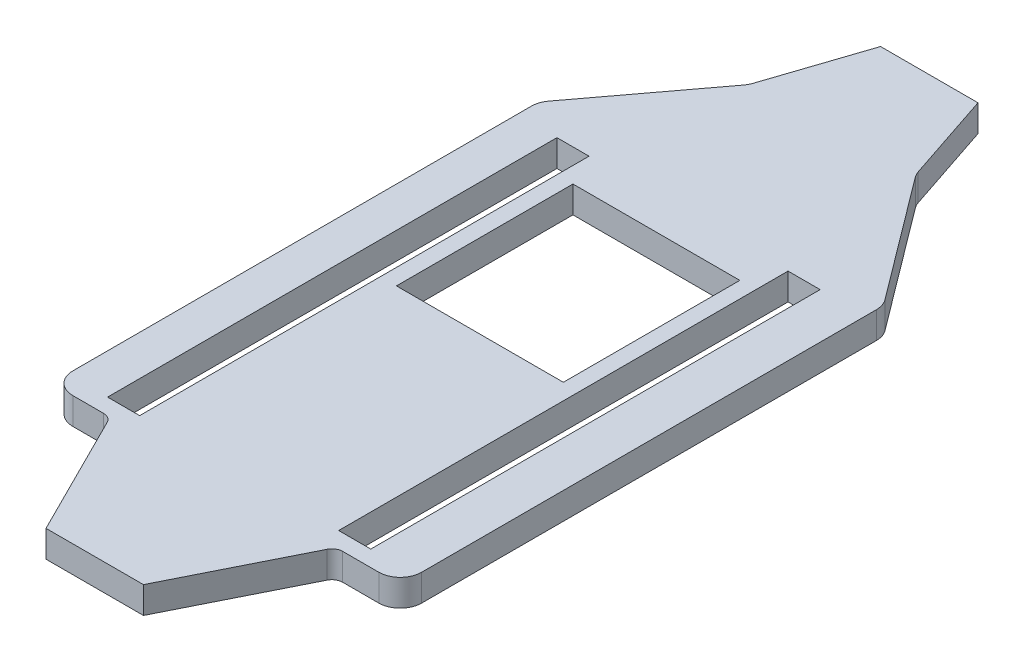
ISO-10303-21;
HEADER;
FILE_DESCRIPTION(('STEP AP214'),'2;1');
FILE_NAME('part.step','',(''),(''),'','','');
FILE_SCHEMA(('AUTOMOTIVE_DESIGN { 1 0 10303 214 1 1 1 1 }'));
ENDSEC;
DATA;
#1=APPLICATION_CONTEXT('core data for automotive mechanical design processes');
#2=APPLICATION_PROTOCOL_DEFINITION('international standard','automotive_design',2000,#1);
#3=PRODUCT_CONTEXT('',#1,'mechanical');
#4=PRODUCT('Part','Part','',(#3));
#5=PRODUCT_RELATED_PRODUCT_CATEGORY('part','',(#4));
#6=PRODUCT_DEFINITION_FORMATION('','',#4);
#7=PRODUCT_DEFINITION_CONTEXT('part definition',#1,'design');
#8=PRODUCT_DEFINITION('design','',#6,#7);
#9=PRODUCT_DEFINITION_SHAPE('','',#8);
#10=(LENGTH_UNIT() NAMED_UNIT(*) SI_UNIT(.MILLI.,.METRE.));
#11=(NAMED_UNIT(*) PLANE_ANGLE_UNIT() SI_UNIT($,.RADIAN.));
#12=(NAMED_UNIT(*) SI_UNIT($,.STERADIAN.) SOLID_ANGLE_UNIT());
#13=UNCERTAINTY_MEASURE_WITH_UNIT(LENGTH_MEASURE(1.E-05),#10,'distance_accuracy_value','');
#14=(GEOMETRIC_REPRESENTATION_CONTEXT(3) GLOBAL_UNCERTAINTY_ASSIGNED_CONTEXT((#13)) GLOBAL_UNIT_ASSIGNED_CONTEXT((#10,
#11,#12)) REPRESENTATION_CONTEXT('',''));
#15=CARTESIAN_POINT('',(0.,0.,0.));
#16=DIRECTION('',(0.,0.,1.));
#17=DIRECTION('',(1.,0.,0.));
#18=AXIS2_PLACEMENT_3D('',#15,#16,#17);
#19=CARTESIAN_POINT('',(-12.994733192202,1.25,-28.8403557437306));
#20=DIRECTION('',(0.,-1.,0.));
#21=DIRECTION('',(0.,0.,-1.));
#22=AXIS2_PLACEMENT_3D('',#19,#20,#21);
#23=PLANE('',#22);
#24=DIRECTION('',(0.,0.,1.));
#25=VECTOR('',#24,1.);
#26=CARTESIAN_POINT('',(-14.4270462766947,1.25,-0.749999999999999));
#27=LINE('',#26,#25);
#28=CARTESIAN_POINT('',(-14.4270462766947,1.25,-21.75));
#29=VERTEX_POINT('',#28);
#30=CARTESIAN_POINT('',(-14.4270462766947,1.25,-0.749999999999999));
#31=VERTEX_POINT('',#30);
#32=EDGE_CURVE('E284',#29,#31,#27,.T.);
#33=ORIENTED_EDGE('',*,*,#32,.F.);
#34=DIRECTION('',(-1.,0.,0.));
#35=VECTOR('',#34,1.);
#36=CARTESIAN_POINT('',(-14.4270462766947,1.25,-21.75));
#37=LINE('',#36,#35);
#38=CARTESIAN_POINT('',(-12.9270462766947,1.25,-21.75));
#39=VERTEX_POINT('',#38);
#40=EDGE_CURVE('E292',#39,#29,#37,.T.);
#41=ORIENTED_EDGE('',*,*,#40,.F.);
#42=DIRECTION('',(0.,0.,-1.));
#43=VECTOR('',#42,1.);
#44=CARTESIAN_POINT('',(-12.9270462766947,1.25,-0.749999999999999));
#45=LINE('',#44,#43);
#46=CARTESIAN_POINT('',(-12.9270462766947,1.25,-0.749999999999999));
#47=VERTEX_POINT('',#46);
#48=EDGE_CURVE('E289',#47,#39,#45,.T.);
#49=ORIENTED_EDGE('',*,*,#48,.F.);
#50=DIRECTION('',(1.,0.,0.));
#51=VECTOR('',#50,1.);
#52=CARTESIAN_POINT('',(-14.4270462766947,1.25,-0.749999999999999));
#53=LINE('',#52,#51);
#54=EDGE_CURVE('E286',#31,#47,#53,.T.);
#55=ORIENTED_EDGE('',*,*,#54,.F.);
#56=EDGE_LOOP('',(#33,#41,#49,#55));
#57=FACE_BOUND('',#56,.T.);
#58=DIRECTION('',(-1.,0.,0.));
#59=VECTOR('',#58,1.);
#60=CARTESIAN_POINT('',(-6.,1.25,-33.));
#61=LINE('',#60,#59);
#62=CARTESIAN_POINT('',(-6.,1.25,-33.));
#63=VERTEX_POINT('',#62);
#64=CARTESIAN_POINT('',(-10.5540925533895,1.25,-33.));
#65=VERTEX_POINT('',#64);
#66=EDGE_CURVE('E346',#63,#65,#61,.T.);
#67=ORIENTED_EDGE('',*,*,#66,.T.);
#68=DIRECTION('',(-0.316227766016836,0.,0.948683298050514));
#69=VECTOR('',#68,1.);
#70=CARTESIAN_POINT('',(-12.0460498941515,1.25,-28.5241279777138));
#71=LINE('',#70,#69);
#72=CARTESIAN_POINT('',(-12.0460498941515,1.25,-28.5241279777138));
#73=VERTEX_POINT('',#72);
#74=EDGE_CURVE('E349',#65,#73,#71,.T.);
#75=ORIENTED_EDGE('',*,*,#74,.T.);
#76=CARTESIAN_POINT('',(-12.994733192202,1.25,-28.8403557437306));
#77=DIRECTION('',(0.,-1.,0.));
#78=DIRECTION('',(0.,0.,-1.));
#79=AXIS2_PLACEMENT_3D('',#76,#77,#78);
#80=CIRCLE('',#79,1.);
#81=CARTESIAN_POINT('',(-12.194733192202,1.25,-28.2403557437306));
#82=VERTEX_POINT('',#81);
#83=EDGE_CURVE('E352',#73,#82,#80,.T.);
#84=ORIENTED_EDGE('',*,*,#83,.T.);
#85=DIRECTION('',(-0.6,0.,0.8));
#86=VECTOR('',#85,1.);
#87=CARTESIAN_POINT('',(-12.194733192202,1.25,-28.2403557437306));
#88=LINE('',#87,#86);
#89=CARTESIAN_POINT('',(-16.1,1.25,-23.0333333333333));
#90=VERTEX_POINT('',#89);
#91=EDGE_CURVE('E354',#82,#90,#88,.T.);
#92=ORIENTED_EDGE('',*,*,#91,.T.);
#93=CARTESIAN_POINT('',(-15.3,1.25,-22.4333333333333));
#94=DIRECTION('',(0.,1.,0.));
#95=DIRECTION('',(0.,0.,-1.));
#96=AXIS2_PLACEMENT_3D('',#93,#94,#95);
#97=CIRCLE('',#96,1.);
#98=CARTESIAN_POINT('',(-16.3,1.25,-22.4333333333333));
#99=VERTEX_POINT('',#98);
#100=EDGE_CURVE('E356',#90,#99,#97,.T.);
#101=ORIENTED_EDGE('',*,*,#100,.T.);
#102=DIRECTION('',(0.,0.,1.));
#103=VECTOR('',#102,1.);
#104=CARTESIAN_POINT('',(-16.3,1.25,-22.4333333333333));
#105=LINE('',#104,#103);
#106=CARTESIAN_POINT('',(-16.3,1.25,-0.999999999999999));
#107=VERTEX_POINT('',#106);
#108=EDGE_CURVE('E358',#99,#107,#105,.T.);
#109=ORIENTED_EDGE('',*,*,#108,.T.);
#110=CARTESIAN_POINT('',(-15.3,1.25,-0.999999999999999));
#111=DIRECTION('',(0.,1.,0.));
#112=DIRECTION('',(0.,0.,1.));
#113=AXIS2_PLACEMENT_3D('',#110,#111,#112);
#114=CIRCLE('',#113,1.);
#115=CARTESIAN_POINT('',(-15.3,1.25,0.));
#116=VERTEX_POINT('',#115);
#117=EDGE_CURVE('E360',#107,#116,#114,.T.);
#118=ORIENTED_EDGE('',*,*,#117,.T.);
#119=DIRECTION('',(1.,0.,0.));
#120=VECTOR('',#119,1.);
#121=CARTESIAN_POINT('',(-15.3,1.25,0.));
#122=LINE('',#121,#120);
#123=CARTESIAN_POINT('',(-13.8631095477644,1.25,0.));
#124=VERTEX_POINT('',#123);
#125=EDGE_CURVE('E362',#116,#124,#122,.T.);
#126=ORIENTED_EDGE('',*,*,#125,.T.);
#127=CARTESIAN_POINT('',(-13.8631095477644,1.25,0.500000000000001));
#128=DIRECTION('',(0.,-1.,0.));
#129=DIRECTION('',(0.,0.,-1.));
#130=AXIS2_PLACEMENT_3D('',#127,#128,#129);
#131=CIRCLE('',#130,0.5);
#132=CARTESIAN_POINT('',(-13.4158959522644,1.25,0.276393202250024));
#133=VERTEX_POINT('',#132);
#134=EDGE_CURVE('E364',#124,#133,#131,.T.);
#135=ORIENTED_EDGE('',*,*,#134,.T.);
#136=DIRECTION('',(0.447213595499958,0.,0.894427190999916));
#137=VECTOR('',#136,1.);
#138=CARTESIAN_POINT('',(-13.4158959522644,1.25,0.276393202250024));
#139=LINE('',#138,#137);
#140=CARTESIAN_POINT('',(-10.5540925533894,1.25,6.));
#141=VERTEX_POINT('',#140);
#142=EDGE_CURVE('E366',#133,#141,#139,.T.);
#143=ORIENTED_EDGE('',*,*,#142,.T.);
#144=DIRECTION('',(1.,0.,0.));
#145=VECTOR('',#144,1.);
#146=CARTESIAN_POINT('',(-10.5540925533894,1.25,6.));
#147=LINE('',#146,#145);
#148=CARTESIAN_POINT('',(-6.,1.25,6.));
#149=VERTEX_POINT('',#148);
#150=EDGE_CURVE('E368',#141,#149,#147,.T.);
#151=ORIENTED_EDGE('',*,*,#150,.T.);
#152=DIRECTION('',(0.447213595499958,0.,-0.894427190999916));
#153=VECTOR('',#152,1.);
#154=CARTESIAN_POINT('',(-6.,1.25,6.));
#155=LINE('',#154,#153);
#156=CARTESIAN_POINT('',(-3.13819660112501,1.25,0.276393202250023));
#157=VERTEX_POINT('',#156);
#158=EDGE_CURVE('E370',#149,#157,#155,.T.);
#159=ORIENTED_EDGE('',*,*,#158,.T.);
#160=CARTESIAN_POINT('',(-2.69098300562505,1.25,0.5));
#161=DIRECTION('',(0.,-1.,0.));
#162=DIRECTION('',(0.,0.,1.));
#163=AXIS2_PLACEMENT_3D('',#160,#161,#162);
#164=CIRCLE('',#163,0.5);
#165=CARTESIAN_POINT('',(-2.69098300562505,1.25,0.));
#166=VERTEX_POINT('',#165);
#167=EDGE_CURVE('E372',#157,#166,#164,.T.);
#168=ORIENTED_EDGE('',*,*,#167,.T.);
#169=DIRECTION('',(1.,0.,0.));
#170=VECTOR('',#169,1.);
#171=CARTESIAN_POINT('',(-2.69098300562505,1.25,0.));
#172=LINE('',#171,#170);
#173=CARTESIAN_POINT('',(-1.00000000000001,1.25,0.));
#174=VERTEX_POINT('',#173);
#175=EDGE_CURVE('E374',#166,#174,#172,.T.);
#176=ORIENTED_EDGE('',*,*,#175,.T.);
#177=CARTESIAN_POINT('',(-1.,1.25,-1.));
#178=DIRECTION('',(0.,1.,0.));
#179=DIRECTION('',(0.,0.,-1.));
#180=AXIS2_PLACEMENT_3D('',#177,#178,#179);
#181=CIRCLE('',#180,1.);
#182=CARTESIAN_POINT('',(0.,1.25,-1.00000000000001));
#183=VERTEX_POINT('',#182);
#184=EDGE_CURVE('E376',#174,#183,#181,.T.);
#185=ORIENTED_EDGE('',*,*,#184,.T.);
#186=DIRECTION('',(0.,0.,-1.));
#187=VECTOR('',#186,1.);
#188=CARTESIAN_POINT('',(0.,1.25,-1.00000000000001));
#189=LINE('',#188,#187);
#190=CARTESIAN_POINT('',(0.,1.25,-22.2521945032491));
#191=VERTEX_POINT('',#190);
#192=EDGE_CURVE('E378',#183,#191,#189,.T.);
#193=ORIENTED_EDGE('',*,*,#192,.T.);
#194=CARTESIAN_POINT('',(-1.,1.25,-22.2521945032491));
#195=DIRECTION('',(0.,1.,0.));
#196=DIRECTION('',(0.,0.,1.));
#197=AXIS2_PLACEMENT_3D('',#194,#195,#196);
#198=CIRCLE('',#197,1.);
#199=CARTESIAN_POINT('',(-0.200000000000001,1.25,-22.8521945032491));
#200=VERTEX_POINT('',#199);
#201=EDGE_CURVE('E380',#191,#200,#198,.T.);
#202=ORIENTED_EDGE('',*,*,#201,.T.);
#203=DIRECTION('',(-0.6,0.,-0.8));
#204=VECTOR('',#203,1.);
#205=CARTESIAN_POINT('',(-0.200000000000001,1.25,-22.8521945032491));
#206=LINE('',#205,#204);
#207=CARTESIAN_POINT('',(-4.45395010584846,1.25,-28.5241279777138));
#208=VERTEX_POINT('',#207);
#209=EDGE_CURVE('E382',#200,#208,#206,.T.);
#210=ORIENTED_EDGE('',*,*,#209,.T.);
#211=CARTESIAN_POINT('',(-3.65395010584846,1.25,-29.1241279777138));
#212=DIRECTION('',(0.,-1.,0.));
#213=DIRECTION('',(0.,0.,1.));
#214=AXIS2_PLACEMENT_3D('',#211,#212,#213);
#215=CIRCLE('',#214,1.);
#216=CARTESIAN_POINT('',(-4.60263340389897,1.25,-28.8079002116969));
#217=VERTEX_POINT('',#216);
#218=EDGE_CURVE('E384',#208,#217,#215,.T.);
#219=ORIENTED_EDGE('',*,*,#218,.T.);
#220=DIRECTION('',(-0.316227766016838,0.,-0.948683298050514));
#221=VECTOR('',#220,1.);
#222=CARTESIAN_POINT('',(-4.60263340389897,1.25,-28.8079002116969));
#223=LINE('',#222,#221);
#224=EDGE_CURVE('E386',#217,#63,#223,.T.);
#225=ORIENTED_EDGE('',*,*,#224,.T.);
#226=EDGE_LOOP('',(#67,#75,#84,#92,#101,#109,#118,#126,#135,#143,#151,#159,#168,#176,#185,#193,
#202,#210,#219,#225));
#227=FACE_BOUND('',#226,.T.);
#228=DIRECTION('',(0.,0.,-1.));
#229=VECTOR('',#228,1.);
#230=CARTESIAN_POINT('',(-2.12704627669473,1.25,-0.75));
#231=LINE('',#230,#229);
#232=CARTESIAN_POINT('',(-2.12704627669473,1.25,-0.75));
#233=VERTEX_POINT('',#232);
#234=CARTESIAN_POINT('',(-2.12704627669474,1.25,-21.75));
#235=VERTEX_POINT('',#234);
#236=EDGE_CURVE('E315',#233,#235,#231,.T.);
#237=ORIENTED_EDGE('',*,*,#236,.F.);
#238=DIRECTION('',(1.,0.,0.));
#239=VECTOR('',#238,1.);
#240=CARTESIAN_POINT('',(-2.12704627669473,1.25,-0.75));
#241=LINE('',#240,#239);
#242=CARTESIAN_POINT('',(-3.62704627669473,1.25,-0.749999999999999));
#243=VERTEX_POINT('',#242);
#244=EDGE_CURVE('E323',#243,#233,#241,.T.);
#245=ORIENTED_EDGE('',*,*,#244,.F.);
#246=DIRECTION('',(0.,0.,1.));
#247=VECTOR('',#246,1.);
#248=CARTESIAN_POINT('',(-3.62704627669473,1.25,-0.75));
#249=LINE('',#248,#247);
#250=CARTESIAN_POINT('',(-3.62704627669474,1.25,-21.75));
#251=VERTEX_POINT('',#250);
#252=EDGE_CURVE('E320',#251,#243,#249,.T.);
#253=ORIENTED_EDGE('',*,*,#252,.F.);
#254=DIRECTION('',(-1.,0.,0.));
#255=VECTOR('',#254,1.);
#256=CARTESIAN_POINT('',(-2.12704627669474,1.25,-21.75));
#257=LINE('',#256,#255);
#258=EDGE_CURVE('E317',#235,#251,#257,.T.);
#259=ORIENTED_EDGE('',*,*,#258,.F.);
#260=EDGE_LOOP('',(#237,#245,#253,#259));
#261=FACE_BOUND('',#260,.T.);
#262=DIRECTION('',(0.,0.,-1.));
#263=VECTOR('',#262,1.);
#264=CARTESIAN_POINT('',(-4.37704627669474,1.25,-12.));
#265=LINE('',#264,#263);
#266=CARTESIAN_POINT('',(-4.37704627669474,1.25,-12.));
#267=VERTEX_POINT('',#266);
#268=CARTESIAN_POINT('',(-4.37704627669474,1.25,-20.2477958394935));
#269=VERTEX_POINT('',#268);
#270=EDGE_CURVE('E248',#267,#269,#265,.T.);
#271=ORIENTED_EDGE('',*,*,#270,.F.);
#272=DIRECTION('',(1.,0.,0.));
#273=VECTOR('',#272,1.);
#274=CARTESIAN_POINT('',(-12.1770462766947,1.25,-12.));
#275=LINE('',#274,#273);
#276=CARTESIAN_POINT('',(-12.1770462766947,1.25,-12.));
#277=VERTEX_POINT('',#276);
#278=EDGE_CURVE('E270',#277,#267,#275,.T.);
#279=ORIENTED_EDGE('',*,*,#278,.F.);
#280=DIRECTION('',(0.,0.,1.));
#281=VECTOR('',#280,1.);
#282=CARTESIAN_POINT('',(-12.1770462766947,1.25,-20.2477958394935));
#283=LINE('',#282,#281);
#284=CARTESIAN_POINT('',(-12.1770462766947,1.25,-20.2477958394935));
#285=VERTEX_POINT('',#284);
#286=EDGE_CURVE('E268',#285,#277,#283,.T.);
#287=ORIENTED_EDGE('',*,*,#286,.F.);
#288=DIRECTION('',(-1.,0.,0.));
#289=VECTOR('',#288,1.);
#290=CARTESIAN_POINT('',(-4.37704627669474,1.25,-20.2477958394935));
#291=LINE('',#290,#289);
#292=EDGE_CURVE('E256',#269,#285,#291,.T.);
#293=ORIENTED_EDGE('',*,*,#292,.F.);
#294=EDGE_LOOP('',(#271,#279,#287,#293));
#295=FACE_BOUND('',#294,.T.);
#296=ADVANCED_FACE('F39',(#57,#227,#261,#295),#23,.F.);
#297=CARTESIAN_POINT('',(-12.994733192202,0.,-28.8403557437306));
#298=DIRECTION('',(0.,-1.,0.));
#299=DIRECTION('',(0.,0.,-1.));
#300=AXIS2_PLACEMENT_3D('',#297,#298,#299);
#301=PLANE('',#300);
#302=DIRECTION('',(-1.,0.,0.));
#303=VECTOR('',#302,1.);
#304=CARTESIAN_POINT('',(-6.,0.,-33.));
#305=LINE('',#304,#303);
#306=CARTESIAN_POINT('',(-6.,0.,-33.));
#307=VERTEX_POINT('',#306);
#308=CARTESIAN_POINT('',(-10.5540925533895,0.,-33.));
#309=VERTEX_POINT('',#308);
#310=EDGE_CURVE('E345',#307,#309,#305,.T.);
#311=ORIENTED_EDGE('',*,*,#310,.F.);
#312=DIRECTION('',(-0.316227766016838,0.,-0.948683298050514));
#313=VECTOR('',#312,1.);
#314=CARTESIAN_POINT('',(-4.60263340389897,0.,-28.8079002116969));
#315=LINE('',#314,#313);
#316=CARTESIAN_POINT('',(-4.60263340389897,0.,-28.8079002116969));
#317=VERTEX_POINT('',#316);
#318=EDGE_CURVE('E350',#317,#307,#315,.T.);
#319=ORIENTED_EDGE('',*,*,#318,.F.);
#320=CARTESIAN_POINT('',(-3.65395010584846,0.,-29.1241279777138));
#321=DIRECTION('',(0.,-1.,0.));
#322=DIRECTION('',(0.,0.,1.));
#323=AXIS2_PLACEMENT_3D('',#320,#321,#322);
#324=CIRCLE('',#323,1.);
#325=CARTESIAN_POINT('',(-4.45395010584846,0.,-28.5241279777138));
#326=VERTEX_POINT('',#325);
#327=EDGE_CURVE('E425',#326,#317,#324,.T.);
#328=ORIENTED_EDGE('',*,*,#327,.F.);
#329=DIRECTION('',(-0.6,0.,-0.8));
#330=VECTOR('',#329,1.);
#331=CARTESIAN_POINT('',(-0.200000000000001,0.,-22.8521945032491));
#332=LINE('',#331,#330);
#333=CARTESIAN_POINT('',(-0.200000000000001,0.,-22.8521945032491));
#334=VERTEX_POINT('',#333);
#335=EDGE_CURVE('E423',#334,#326,#332,.T.);
#336=ORIENTED_EDGE('',*,*,#335,.F.);
#337=CARTESIAN_POINT('',(-1.,0.,-22.2521945032491));
#338=DIRECTION('',(0.,1.,0.));
#339=DIRECTION('',(0.,0.,1.));
#340=AXIS2_PLACEMENT_3D('',#337,#338,#339);
#341=CIRCLE('',#340,1.);
#342=CARTESIAN_POINT('',(0.,0.,-22.2521945032491));
#343=VERTEX_POINT('',#342);
#344=EDGE_CURVE('E421',#343,#334,#341,.T.);
#345=ORIENTED_EDGE('',*,*,#344,.F.);
#346=DIRECTION('',(0.,0.,-1.));
#347=VECTOR('',#346,1.);
#348=CARTESIAN_POINT('',(0.,0.,-1.00000000000001));
#349=LINE('',#348,#347);
#350=CARTESIAN_POINT('',(0.,0.,-1.00000000000001));
#351=VERTEX_POINT('',#350);
#352=EDGE_CURVE('E419',#351,#343,#349,.T.);
#353=ORIENTED_EDGE('',*,*,#352,.F.);
#354=CARTESIAN_POINT('',(-1.,0.,-1.));
#355=DIRECTION('',(0.,1.,0.));
#356=DIRECTION('',(0.,0.,-1.));
#357=AXIS2_PLACEMENT_3D('',#354,#355,#356);
#358=CIRCLE('',#357,1.);
#359=CARTESIAN_POINT('',(-1.00000000000001,0.,0.));
#360=VERTEX_POINT('',#359);
#361=EDGE_CURVE('E417',#360,#351,#358,.T.);
#362=ORIENTED_EDGE('',*,*,#361,.F.);
#363=DIRECTION('',(1.,0.,0.));
#364=VECTOR('',#363,1.);
#365=CARTESIAN_POINT('',(-2.69098300562505,0.,0.));
#366=LINE('',#365,#364);
#367=CARTESIAN_POINT('',(-2.69098300562505,0.,0.));
#368=VERTEX_POINT('',#367);
#369=EDGE_CURVE('E415',#368,#360,#366,.T.);
#370=ORIENTED_EDGE('',*,*,#369,.F.);
#371=CARTESIAN_POINT('',(-2.69098300562505,0.,0.5));
#372=DIRECTION('',(0.,-1.,0.));
#373=DIRECTION('',(0.,0.,1.));
#374=AXIS2_PLACEMENT_3D('',#371,#372,#373);
#375=CIRCLE('',#374,0.5);
#376=CARTESIAN_POINT('',(-3.13819660112501,0.,0.276393202250023));
#377=VERTEX_POINT('',#376);
#378=EDGE_CURVE('E413',#377,#368,#375,.T.);
#379=ORIENTED_EDGE('',*,*,#378,.F.);
#380=DIRECTION('',(0.447213595499958,0.,-0.894427190999916));
#381=VECTOR('',#380,1.);
#382=CARTESIAN_POINT('',(-6.,0.,6.));
#383=LINE('',#382,#381);
#384=CARTESIAN_POINT('',(-6.,0.,6.));
#385=VERTEX_POINT('',#384);
#386=EDGE_CURVE('E411',#385,#377,#383,.T.);
#387=ORIENTED_EDGE('',*,*,#386,.F.);
#388=DIRECTION('',(1.,0.,0.));
#389=VECTOR('',#388,1.);
#390=CARTESIAN_POINT('',(-10.5540925533894,0.,6.));
#391=LINE('',#390,#389);
#392=CARTESIAN_POINT('',(-10.5540925533894,0.,6.));
#393=VERTEX_POINT('',#392);
#394=EDGE_CURVE('E409',#393,#385,#391,.T.);
#395=ORIENTED_EDGE('',*,*,#394,.F.);
#396=DIRECTION('',(0.447213595499958,0.,0.894427190999916));
#397=VECTOR('',#396,1.);
#398=CARTESIAN_POINT('',(-13.4158959522644,0.,0.276393202250024));
#399=LINE('',#398,#397);
#400=CARTESIAN_POINT('',(-13.4158959522644,0.,0.276393202250024));
#401=VERTEX_POINT('',#400);
#402=EDGE_CURVE('E407',#401,#393,#399,.T.);
#403=ORIENTED_EDGE('',*,*,#402,.F.);
#404=CARTESIAN_POINT('',(-13.8631095477644,0.,0.500000000000001));
#405=DIRECTION('',(0.,-1.,0.));
#406=DIRECTION('',(0.,0.,-1.));
#407=AXIS2_PLACEMENT_3D('',#404,#405,#406);
#408=CIRCLE('',#407,0.5);
#409=CARTESIAN_POINT('',(-13.8631095477644,0.,0.));
#410=VERTEX_POINT('',#409);
#411=EDGE_CURVE('E405',#410,#401,#408,.T.);
#412=ORIENTED_EDGE('',*,*,#411,.F.);
#413=DIRECTION('',(1.,0.,0.));
#414=VECTOR('',#413,1.);
#415=CARTESIAN_POINT('',(-15.3,0.,0.));
#416=LINE('',#415,#414);
#417=CARTESIAN_POINT('',(-15.3,0.,0.));
#418=VERTEX_POINT('',#417);
#419=EDGE_CURVE('E403',#418,#410,#416,.T.);
#420=ORIENTED_EDGE('',*,*,#419,.F.);
#421=CARTESIAN_POINT('',(-15.3,0.,-0.999999999999999));
#422=DIRECTION('',(0.,1.,0.));
#423=DIRECTION('',(0.,0.,1.));
#424=AXIS2_PLACEMENT_3D('',#421,#422,#423);
#425=CIRCLE('',#424,1.);
#426=CARTESIAN_POINT('',(-16.3,0.,-0.999999999999999));
#427=VERTEX_POINT('',#426);
#428=EDGE_CURVE('E401',#427,#418,#425,.T.);
#429=ORIENTED_EDGE('',*,*,#428,.F.);
#430=DIRECTION('',(0.,0.,1.));
#431=VECTOR('',#430,1.);
#432=CARTESIAN_POINT('',(-16.3,0.,-22.4333333333333));
#433=LINE('',#432,#431);
#434=CARTESIAN_POINT('',(-16.3,0.,-22.4333333333333));
#435=VERTEX_POINT('',#434);
#436=EDGE_CURVE('E399',#435,#427,#433,.T.);
#437=ORIENTED_EDGE('',*,*,#436,.F.);
#438=CARTESIAN_POINT('',(-15.3,0.,-22.4333333333333));
#439=DIRECTION('',(0.,1.,0.));
#440=DIRECTION('',(0.,0.,-1.));
#441=AXIS2_PLACEMENT_3D('',#438,#439,#440);
#442=CIRCLE('',#441,1.);
#443=CARTESIAN_POINT('',(-16.1,0.,-23.0333333333333));
#444=VERTEX_POINT('',#443);
#445=EDGE_CURVE('E397',#444,#435,#442,.T.);
#446=ORIENTED_EDGE('',*,*,#445,.F.);
#447=DIRECTION('',(-0.6,0.,0.8));
#448=VECTOR('',#447,1.);
#449=CARTESIAN_POINT('',(-12.194733192202,0.,-28.2403557437306));
#450=LINE('',#449,#448);
#451=CARTESIAN_POINT('',(-12.194733192202,0.,-28.2403557437306));
#452=VERTEX_POINT('',#451);
#453=EDGE_CURVE('E395',#452,#444,#450,.T.);
#454=ORIENTED_EDGE('',*,*,#453,.F.);
#455=CARTESIAN_POINT('',(-12.994733192202,0.,-28.8403557437306));
#456=DIRECTION('',(0.,-1.,0.));
#457=DIRECTION('',(0.,0.,-1.));
#458=AXIS2_PLACEMENT_3D('',#455,#456,#457);
#459=CIRCLE('',#458,1.);
#460=CARTESIAN_POINT('',(-12.0460498941515,0.,-28.5241279777138));
#461=VERTEX_POINT('',#460);
#462=EDGE_CURVE('E393',#461,#452,#459,.T.);
#463=ORIENTED_EDGE('',*,*,#462,.F.);
#464=DIRECTION('',(-0.316227766016836,0.,0.948683298050514));
#465=VECTOR('',#464,1.);
#466=CARTESIAN_POINT('',(-12.0460498941515,0.,-28.5241279777138));
#467=LINE('',#466,#465);
#468=EDGE_CURVE('E391',#309,#461,#467,.T.);
#469=ORIENTED_EDGE('',*,*,#468,.F.);
#470=EDGE_LOOP('',(#311,#319,#328,#336,#345,#353,#362,#370,#379,#387,#395,#403,#412,#420,#429,
#437,#446,#454,#463,#469));
#471=FACE_BOUND('',#470,.T.);
#472=DIRECTION('',(1.,0.,0.));
#473=VECTOR('',#472,1.);
#474=CARTESIAN_POINT('',(-2.12704627669473,0.,-0.75));
#475=LINE('',#474,#473);
#476=CARTESIAN_POINT('',(-3.62704627669473,0.,-0.75));
#477=VERTEX_POINT('',#476);
#478=CARTESIAN_POINT('',(-2.12704627669473,0.,-0.75));
#479=VERTEX_POINT('',#478);
#480=EDGE_CURVE('E318',#477,#479,#475,.T.);
#481=ORIENTED_EDGE('',*,*,#480,.T.);
#482=DIRECTION('',(0.,0.,-1.));
#483=VECTOR('',#482,1.);
#484=CARTESIAN_POINT('',(-2.12704627669473,0.,-0.75));
#485=LINE('',#484,#483);
#486=CARTESIAN_POINT('',(-2.12704627669474,0.,-21.75));
#487=VERTEX_POINT('',#486);
#488=EDGE_CURVE('E314',#479,#487,#485,.T.);
#489=ORIENTED_EDGE('',*,*,#488,.T.);
#490=DIRECTION('',(-1.,0.,0.));
#491=VECTOR('',#490,1.);
#492=CARTESIAN_POINT('',(-2.12704627669474,0.,-21.75));
#493=LINE('',#492,#491);
#494=CARTESIAN_POINT('',(-3.62704627669474,0.,-21.75));
#495=VERTEX_POINT('',#494);
#496=EDGE_CURVE('E328',#487,#495,#493,.T.);
#497=ORIENTED_EDGE('',*,*,#496,.T.);
#498=DIRECTION('',(0.,0.,1.));
#499=VECTOR('',#498,1.);
#500=CARTESIAN_POINT('',(-3.62704627669473,0.,-0.75));
#501=LINE('',#500,#499);
#502=EDGE_CURVE('E331',#495,#477,#501,.T.);
#503=ORIENTED_EDGE('',*,*,#502,.T.);
#504=EDGE_LOOP('',(#481,#489,#497,#503));
#505=FACE_BOUND('',#504,.T.);
#506=DIRECTION('',(-1.,0.,0.));
#507=VECTOR('',#506,1.);
#508=CARTESIAN_POINT('',(-14.4270462766947,0.,-21.75));
#509=LINE('',#508,#507);
#510=CARTESIAN_POINT('',(-12.9270462766947,0.,-21.75));
#511=VERTEX_POINT('',#510);
#512=CARTESIAN_POINT('',(-14.4270462766947,0.,-21.75));
#513=VERTEX_POINT('',#512);
#514=EDGE_CURVE('E287',#511,#513,#509,.T.);
#515=ORIENTED_EDGE('',*,*,#514,.T.);
#516=DIRECTION('',(0.,0.,1.));
#517=VECTOR('',#516,1.);
#518=CARTESIAN_POINT('',(-14.4270462766947,0.,-0.749999999999999));
#519=LINE('',#518,#517);
#520=CARTESIAN_POINT('',(-14.4270462766947,0.,-0.749999999999999));
#521=VERTEX_POINT('',#520);
#522=EDGE_CURVE('E264',#513,#521,#519,.T.);
#523=ORIENTED_EDGE('',*,*,#522,.T.);
#524=DIRECTION('',(1.,0.,0.));
#525=VECTOR('',#524,1.);
#526=CARTESIAN_POINT('',(-14.4270462766947,0.,-0.749999999999999));
#527=LINE('',#526,#525);
#528=CARTESIAN_POINT('',(-12.9270462766947,0.,-0.749999999999999));
#529=VERTEX_POINT('',#528);
#530=EDGE_CURVE('E297',#521,#529,#527,.T.);
#531=ORIENTED_EDGE('',*,*,#530,.T.);
#532=DIRECTION('',(0.,0.,-1.));
#533=VECTOR('',#532,1.);
#534=CARTESIAN_POINT('',(-12.9270462766947,0.,-0.749999999999999));
#535=LINE('',#534,#533);
#536=EDGE_CURVE('E300',#529,#511,#535,.T.);
#537=ORIENTED_EDGE('',*,*,#536,.T.);
#538=EDGE_LOOP('',(#515,#523,#531,#537));
#539=FACE_BOUND('',#538,.T.);
#540=DIRECTION('',(1.,0.,0.));
#541=VECTOR('',#540,1.);
#542=CARTESIAN_POINT('',(-12.1770462766947,0.,-12.));
#543=LINE('',#542,#541);
#544=CARTESIAN_POINT('',(-12.1770462766947,0.,-12.));
#545=VERTEX_POINT('',#544);
#546=CARTESIAN_POINT('',(-4.37704627669474,0.,-12.));
#547=VERTEX_POINT('',#546);
#548=EDGE_CURVE('E257',#545,#547,#543,.T.);
#549=ORIENTED_EDGE('',*,*,#548,.T.);
#550=DIRECTION('',(0.,0.,-1.));
#551=VECTOR('',#550,1.);
#552=CARTESIAN_POINT('',(-4.37704627669474,0.,-12.));
#553=LINE('',#552,#551);
#554=CARTESIAN_POINT('',(-4.37704627669474,0.,-20.2477958394935));
#555=VERTEX_POINT('',#554);
#556=EDGE_CURVE('E62',#547,#555,#553,.T.);
#557=ORIENTED_EDGE('',*,*,#556,.T.);
#558=DIRECTION('',(-1.,0.,0.));
#559=VECTOR('',#558,1.);
#560=CARTESIAN_POINT('',(-4.37704627669474,0.,-20.2477958394935));
#561=LINE('',#560,#559);
#562=CARTESIAN_POINT('',(-12.1770462766947,0.,-20.2477958394935));
#563=VERTEX_POINT('',#562);
#564=EDGE_CURVE('E263',#555,#563,#561,.T.);
#565=ORIENTED_EDGE('',*,*,#564,.T.);
#566=DIRECTION('',(0.,0.,1.));
#567=VECTOR('',#566,1.);
#568=CARTESIAN_POINT('',(-12.1770462766947,0.,-20.2477958394935));
#569=LINE('',#568,#567);
#570=EDGE_CURVE('E276',#563,#545,#569,.T.);
#571=ORIENTED_EDGE('',*,*,#570,.T.);
#572=EDGE_LOOP('',(#549,#557,#565,#571));
#573=FACE_BOUND('',#572,.T.);
#574=ADVANCED_FACE('F491',(#471,#505,#539,#573),#301,.T.);
#575=CARTESIAN_POINT('',(-6.,1.25,-33.));
#576=DIRECTION('',(0.,0.,1.));
#577=DIRECTION('',(1.,0.,0.));
#578=AXIS2_PLACEMENT_3D('',#575,#576,#577);
#579=PLANE('',#578);
#580=ORIENTED_EDGE('',*,*,#310,.T.);
#581=DIRECTION('',(0.,-1.,0.));
#582=VECTOR('',#581,1.);
#583=CARTESIAN_POINT('',(-10.5540925533895,1.25,-33.));
#584=LINE('',#583,#582);
#585=EDGE_CURVE('E11',#65,#309,#584,.T.);
#586=ORIENTED_EDGE('',*,*,#585,.F.);
#587=ORIENTED_EDGE('',*,*,#66,.F.);
#588=DIRECTION('',(0.,-1.,0.));
#589=VECTOR('',#588,1.);
#590=CARTESIAN_POINT('',(-6.,1.25,-33.));
#591=LINE('',#590,#589);
#592=EDGE_CURVE('E388',#63,#307,#591,.T.);
#593=ORIENTED_EDGE('',*,*,#592,.T.);
#594=EDGE_LOOP('',(#580,#586,#587,#593));
#595=FACE_BOUND('',#594,.T.);
#596=ADVANCED_FACE('F41',(#595),#579,.F.);
#597=CARTESIAN_POINT('',(-12.0460498941515,1.25,-28.5241279777138));
#598=DIRECTION('',(0.948683298050514,0.,0.316227766016836));
#599=DIRECTION('',(0.316227766016836,0.,-0.948683298050514));
#600=AXIS2_PLACEMENT_3D('',#597,#598,#599);
#601=PLANE('',#600);
#602=ORIENTED_EDGE('',*,*,#468,.T.);
#603=DIRECTION('',(0.,-1.,0.));
#604=VECTOR('',#603,1.);
#605=CARTESIAN_POINT('',(-12.0460498941515,1.25,-28.5241279777138));
#606=LINE('',#605,#604);
#607=EDGE_CURVE('E47',#73,#461,#606,.T.);
#608=ORIENTED_EDGE('',*,*,#607,.F.);
#609=ORIENTED_EDGE('',*,*,#74,.F.);
#610=ORIENTED_EDGE('',*,*,#585,.T.);
#611=EDGE_LOOP('',(#602,#608,#609,#610));
#612=FACE_BOUND('',#611,.T.);
#613=ADVANCED_FACE('F509',(#612),#601,.F.);
#614=CARTESIAN_POINT('',(-12.994733192202,1.25,-28.8403557437306));
#615=DIRECTION('',(0.,-1.,0.));
#616=DIRECTION('',(0.,0.,-1.));
#617=AXIS2_PLACEMENT_3D('',#614,#615,#616);
#618=CYLINDRICAL_SURFACE('',#617,1.);
#619=ORIENTED_EDGE('',*,*,#462,.T.);
#620=DIRECTION('',(0.,-1.,0.));
#621=VECTOR('',#620,1.);
#622=CARTESIAN_POINT('',(-12.194733192202,1.25,-28.2403557437306));
#623=LINE('',#622,#621);
#624=EDGE_CURVE('E478',#82,#452,#623,.T.);
#625=ORIENTED_EDGE('',*,*,#624,.F.);
#626=ORIENTED_EDGE('',*,*,#83,.F.);
#627=ORIENTED_EDGE('',*,*,#607,.T.);
#628=EDGE_LOOP('',(#619,#625,#626,#627));
#629=FACE_BOUND('',#628,.T.);
#630=ADVANCED_FACE('F485',(#629),#618,.F.);
#631=CARTESIAN_POINT('',(-12.194733192202,1.25,-28.2403557437306));
#632=DIRECTION('',(0.8,0.,0.6));
#633=DIRECTION('',(0.6,0.,-0.8));
#634=AXIS2_PLACEMENT_3D('',#631,#632,#633);
#635=PLANE('',#634);
#636=ORIENTED_EDGE('',*,*,#453,.T.);
#637=DIRECTION('',(0.,-1.,0.));
#638=VECTOR('',#637,1.);
#639=CARTESIAN_POINT('',(-16.1,1.25,-23.0333333333333));
#640=LINE('',#639,#638);
#641=EDGE_CURVE('E475',#90,#444,#640,.T.);
#642=ORIENTED_EDGE('',*,*,#641,.F.);
#643=ORIENTED_EDGE('',*,*,#91,.F.);
#644=ORIENTED_EDGE('',*,*,#624,.T.);
#645=EDGE_LOOP('',(#636,#642,#643,#644));
#646=FACE_BOUND('',#645,.T.);
#647=ADVANCED_FACE('F497',(#646),#635,.F.);
#648=CARTESIAN_POINT('',(-15.3,1.25,-22.4333333333333));
#649=DIRECTION('',(0.,-1.,0.));
#650=DIRECTION('',(0.,0.,-1.));
#651=AXIS2_PLACEMENT_3D('',#648,#649,#650);
#652=CYLINDRICAL_SURFACE('',#651,1.);
#653=ORIENTED_EDGE('',*,*,#445,.T.);
#654=DIRECTION('',(0.,-1.,0.));
#655=VECTOR('',#654,1.);
#656=CARTESIAN_POINT('',(-16.3,1.25,-22.4333333333333));
#657=LINE('',#656,#655);
#658=EDGE_CURVE('E472',#99,#435,#657,.T.);
#659=ORIENTED_EDGE('',*,*,#658,.F.);
#660=ORIENTED_EDGE('',*,*,#100,.F.);
#661=ORIENTED_EDGE('',*,*,#641,.T.);
#662=EDGE_LOOP('',(#653,#659,#660,#661));
#663=FACE_BOUND('',#662,.T.);
#664=ADVANCED_FACE('F501',(#663),#652,.T.);
#665=CARTESIAN_POINT('',(-16.3,1.25,-22.4333333333333));
#666=DIRECTION('',(1.,0.,0.));
#667=DIRECTION('',(0.,0.,-1.));
#668=AXIS2_PLACEMENT_3D('',#665,#666,#667);
#669=PLANE('',#668);
#670=ORIENTED_EDGE('',*,*,#436,.T.);
#671=DIRECTION('',(0.,-1.,0.));
#672=VECTOR('',#671,1.);
#673=CARTESIAN_POINT('',(-16.3,1.25,-0.999999999999999));
#674=LINE('',#673,#672);
#675=EDGE_CURVE('E469',#107,#427,#674,.T.);
#676=ORIENTED_EDGE('',*,*,#675,.F.);
#677=ORIENTED_EDGE('',*,*,#108,.F.);
#678=ORIENTED_EDGE('',*,*,#658,.T.);
#679=EDGE_LOOP('',(#670,#676,#677,#678));
#680=FACE_BOUND('',#679,.T.);
#681=ADVANCED_FACE('F582',(#680),#669,.F.);
#682=CARTESIAN_POINT('',(-15.3,1.25,-0.999999999999999));
#683=DIRECTION('',(0.,-1.,0.));
#684=DIRECTION('',(0.,0.,-1.));
#685=AXIS2_PLACEMENT_3D('',#682,#683,#684);
#686=CYLINDRICAL_SURFACE('',#685,1.);
#687=ORIENTED_EDGE('',*,*,#428,.T.);
#688=DIRECTION('',(0.,-1.,0.));
#689=VECTOR('',#688,1.);
#690=CARTESIAN_POINT('',(-15.3,1.25,0.));
#691=LINE('',#690,#689);
#692=EDGE_CURVE('E466',#116,#418,#691,.T.);
#693=ORIENTED_EDGE('',*,*,#692,.F.);
#694=ORIENTED_EDGE('',*,*,#117,.F.);
#695=ORIENTED_EDGE('',*,*,#675,.T.);
#696=EDGE_LOOP('',(#687,#693,#694,#695));
#697=FACE_BOUND('',#696,.T.);
#698=ADVANCED_FACE('F580',(#697),#686,.T.);
#699=CARTESIAN_POINT('',(-15.3,1.25,0.));
#700=DIRECTION('',(0.,0.,-1.));
#701=DIRECTION('',(-1.,0.,0.));
#702=AXIS2_PLACEMENT_3D('',#699,#700,#701);
#703=PLANE('',#702);
#704=ORIENTED_EDGE('',*,*,#419,.T.);
#705=DIRECTION('',(0.,-1.,0.));
#706=VECTOR('',#705,1.);
#707=CARTESIAN_POINT('',(-13.8631095477644,1.25,0.));
#708=LINE('',#707,#706);
#709=EDGE_CURVE('E463',#124,#410,#708,.T.);
#710=ORIENTED_EDGE('',*,*,#709,.F.);
#711=ORIENTED_EDGE('',*,*,#125,.F.);
#712=ORIENTED_EDGE('',*,*,#692,.T.);
#713=EDGE_LOOP('',(#704,#710,#711,#712));
#714=FACE_BOUND('',#713,.T.);
#715=ADVANCED_FACE('F575',(#714),#703,.F.);
#716=CARTESIAN_POINT('',(-13.8631095477644,1.25,0.500000000000001));
#717=DIRECTION('',(0.,-1.,0.));
#718=DIRECTION('',(0.,0.,-1.));
#719=AXIS2_PLACEMENT_3D('',#716,#717,#718);
#720=CYLINDRICAL_SURFACE('',#719,0.5);
#721=ORIENTED_EDGE('',*,*,#411,.T.);
#722=DIRECTION('',(0.,-1.,0.));
#723=VECTOR('',#722,1.);
#724=CARTESIAN_POINT('',(-13.4158959522644,1.25,0.276393202250024));
#725=LINE('',#724,#723);
#726=EDGE_CURVE('E460',#133,#401,#725,.T.);
#727=ORIENTED_EDGE('',*,*,#726,.F.);
#728=ORIENTED_EDGE('',*,*,#134,.F.);
#729=ORIENTED_EDGE('',*,*,#709,.T.);
#730=EDGE_LOOP('',(#721,#727,#728,#729));
#731=FACE_BOUND('',#730,.T.);
#732=ADVANCED_FACE('F570',(#731),#720,.F.);
#733=CARTESIAN_POINT('',(-13.4158959522644,1.25,0.276393202250024));
#734=DIRECTION('',(0.894427190999916,0.,-0.447213595499958));
#735=DIRECTION('',(-0.447213595499958,0.,-0.894427190999916));
#736=AXIS2_PLACEMENT_3D('',#733,#734,#735);
#737=PLANE('',#736);
#738=ORIENTED_EDGE('',*,*,#402,.T.);
#739=DIRECTION('',(0.,-1.,0.));
#740=VECTOR('',#739,1.);
#741=CARTESIAN_POINT('',(-10.5540925533894,1.25,6.));
#742=LINE('',#741,#740);
#743=EDGE_CURVE('E457',#141,#393,#742,.T.);
#744=ORIENTED_EDGE('',*,*,#743,.F.);
#745=ORIENTED_EDGE('',*,*,#142,.F.);
#746=ORIENTED_EDGE('',*,*,#726,.T.);
#747=EDGE_LOOP('',(#738,#744,#745,#746));
#748=FACE_BOUND('',#747,.T.);
#749=ADVANCED_FACE('F566',(#748),#737,.F.);
#750=CARTESIAN_POINT('',(-10.5540925533894,1.25,6.));
#751=DIRECTION('',(0.,0.,-1.));
#752=DIRECTION('',(-1.,0.,0.));
#753=AXIS2_PLACEMENT_3D('',#750,#751,#752);
#754=PLANE('',#753);
#755=ORIENTED_EDGE('',*,*,#394,.T.);
#756=DIRECTION('',(0.,-1.,0.));
#757=VECTOR('',#756,1.);
#758=CARTESIAN_POINT('',(-6.,1.25,6.));
#759=LINE('',#758,#757);
#760=EDGE_CURVE('E454',#149,#385,#759,.T.);
#761=ORIENTED_EDGE('',*,*,#760,.F.);
#762=ORIENTED_EDGE('',*,*,#150,.F.);
#763=ORIENTED_EDGE('',*,*,#743,.T.);
#764=EDGE_LOOP('',(#755,#761,#762,#763));
#765=FACE_BOUND('',#764,.T.);
#766=ADVANCED_FACE('F561',(#765),#754,.F.);
#767=CARTESIAN_POINT('',(-6.,1.25,6.));
#768=DIRECTION('',(-0.894427190999916,0.,-0.447213595499958));
#769=DIRECTION('',(-0.447213595499958,0.,0.894427190999916));
#770=AXIS2_PLACEMENT_3D('',#767,#768,#769);
#771=PLANE('',#770);
#772=ORIENTED_EDGE('',*,*,#386,.T.);
#773=DIRECTION('',(0.,-1.,0.));
#774=VECTOR('',#773,1.);
#775=CARTESIAN_POINT('',(-3.13819660112501,1.25,0.276393202250023));
#776=LINE('',#775,#774);
#777=EDGE_CURVE('E451',#157,#377,#776,.T.);
#778=ORIENTED_EDGE('',*,*,#777,.F.);
#779=ORIENTED_EDGE('',*,*,#158,.F.);
#780=ORIENTED_EDGE('',*,*,#760,.T.);
#781=EDGE_LOOP('',(#772,#778,#779,#780));
#782=FACE_BOUND('',#781,.T.);
#783=ADVANCED_FACE('F555',(#782),#771,.F.);
#784=CARTESIAN_POINT('',(-2.69098300562505,1.25,0.5));
#785=DIRECTION('',(0.,-1.,0.));
#786=DIRECTION('',(0.,0.,-1.));
#787=AXIS2_PLACEMENT_3D('',#784,#785,#786);
#788=CYLINDRICAL_SURFACE('',#787,0.5);
#789=ORIENTED_EDGE('',*,*,#378,.T.);
#790=DIRECTION('',(0.,-1.,0.));
#791=VECTOR('',#790,1.);
#792=CARTESIAN_POINT('',(-2.69098300562505,1.25,0.));
#793=LINE('',#792,#791);
#794=EDGE_CURVE('E448',#166,#368,#793,.T.);
#795=ORIENTED_EDGE('',*,*,#794,.F.);
#796=ORIENTED_EDGE('',*,*,#167,.F.);
#797=ORIENTED_EDGE('',*,*,#777,.T.);
#798=EDGE_LOOP('',(#789,#795,#796,#797));
#799=FACE_BOUND('',#798,.T.);
#800=ADVANCED_FACE('F551',(#799),#788,.F.);
#801=CARTESIAN_POINT('',(-2.69098300562505,1.25,0.));
#802=DIRECTION('',(0.,0.,-1.));
#803=DIRECTION('',(-1.,0.,0.));
#804=AXIS2_PLACEMENT_3D('',#801,#802,#803);
#805=PLANE('',#804);
#806=ORIENTED_EDGE('',*,*,#369,.T.);
#807=DIRECTION('',(0.,-1.,0.));
#808=VECTOR('',#807,1.);
#809=CARTESIAN_POINT('',(-1.00000000000001,1.25,0.));
#810=LINE('',#809,#808);
#811=EDGE_CURVE('E445',#174,#360,#810,.T.);
#812=ORIENTED_EDGE('',*,*,#811,.F.);
#813=ORIENTED_EDGE('',*,*,#175,.F.);
#814=ORIENTED_EDGE('',*,*,#794,.T.);
#815=EDGE_LOOP('',(#806,#812,#813,#814));
#816=FACE_BOUND('',#815,.T.);
#817=ADVANCED_FACE('F546',(#816),#805,.F.);
#818=CARTESIAN_POINT('',(-1.,1.25,-1.));
#819=DIRECTION('',(0.,-1.,0.));
#820=DIRECTION('',(0.,0.,-1.));
#821=AXIS2_PLACEMENT_3D('',#818,#819,#820);
#822=CYLINDRICAL_SURFACE('',#821,1.);
#823=ORIENTED_EDGE('',*,*,#361,.T.);
#824=DIRECTION('',(0.,-1.,0.));
#825=VECTOR('',#824,1.);
#826=CARTESIAN_POINT('',(0.,1.25,-1.00000000000001));
#827=LINE('',#826,#825);
#828=EDGE_CURVE('E442',#183,#351,#827,.T.);
#829=ORIENTED_EDGE('',*,*,#828,.F.);
#830=ORIENTED_EDGE('',*,*,#184,.F.);
#831=ORIENTED_EDGE('',*,*,#811,.T.);
#832=EDGE_LOOP('',(#823,#829,#830,#831));
#833=FACE_BOUND('',#832,.T.);
#834=ADVANCED_FACE('F540',(#833),#822,.T.);
#835=CARTESIAN_POINT('',(0.,1.25,-1.00000000000001));
#836=DIRECTION('',(-1.,0.,0.));
#837=DIRECTION('',(0.,0.,1.));
#838=AXIS2_PLACEMENT_3D('',#835,#836,#837);
#839=PLANE('',#838);
#840=ORIENTED_EDGE('',*,*,#352,.T.);
#841=DIRECTION('',(0.,-1.,0.));
#842=VECTOR('',#841,1.);
#843=CARTESIAN_POINT('',(0.,1.25,-22.2521945032491));
#844=LINE('',#843,#842);
#845=EDGE_CURVE('E439',#191,#343,#844,.T.);
#846=ORIENTED_EDGE('',*,*,#845,.F.);
#847=ORIENTED_EDGE('',*,*,#192,.F.);
#848=ORIENTED_EDGE('',*,*,#828,.T.);
#849=EDGE_LOOP('',(#840,#846,#847,#848));
#850=FACE_BOUND('',#849,.T.);
#851=ADVANCED_FACE('F536',(#850),#839,.F.);
#852=CARTESIAN_POINT('',(-1.,1.25,-22.2521945032491));
#853=DIRECTION('',(0.,-1.,0.));
#854=DIRECTION('',(0.,0.,-1.));
#855=AXIS2_PLACEMENT_3D('',#852,#853,#854);
#856=CYLINDRICAL_SURFACE('',#855,1.);
#857=ORIENTED_EDGE('',*,*,#344,.T.);
#858=DIRECTION('',(0.,-1.,0.));
#859=VECTOR('',#858,1.);
#860=CARTESIAN_POINT('',(-0.200000000000001,1.25,-22.8521945032491));
#861=LINE('',#860,#859);
#862=EDGE_CURVE('E436',#200,#334,#861,.T.);
#863=ORIENTED_EDGE('',*,*,#862,.F.);
#864=ORIENTED_EDGE('',*,*,#201,.F.);
#865=ORIENTED_EDGE('',*,*,#845,.T.);
#866=EDGE_LOOP('',(#857,#863,#864,#865));
#867=FACE_BOUND('',#866,.T.);
#868=ADVANCED_FACE('F531',(#867),#856,.T.);
#869=CARTESIAN_POINT('',(-0.200000000000001,1.25,-22.8521945032491));
#870=DIRECTION('',(-0.8,0.,0.6));
#871=DIRECTION('',(0.6,0.,0.8));
#872=AXIS2_PLACEMENT_3D('',#869,#870,#871);
#873=PLANE('',#872);
#874=ORIENTED_EDGE('',*,*,#335,.T.);
#875=DIRECTION('',(0.,-1.,0.));
#876=VECTOR('',#875,1.);
#877=CARTESIAN_POINT('',(-4.45395010584846,1.25,-28.5241279777138));
#878=LINE('',#877,#876);
#879=EDGE_CURVE('E433',#208,#326,#878,.T.);
#880=ORIENTED_EDGE('',*,*,#879,.F.);
#881=ORIENTED_EDGE('',*,*,#209,.F.);
#882=ORIENTED_EDGE('',*,*,#862,.T.);
#883=EDGE_LOOP('',(#874,#880,#881,#882));
#884=FACE_BOUND('',#883,.T.);
#885=ADVANCED_FACE('F525',(#884),#873,.F.);
#886=CARTESIAN_POINT('',(-3.65395010584846,1.25,-29.1241279777138));
#887=DIRECTION('',(0.,-1.,0.));
#888=DIRECTION('',(0.,0.,-1.));
#889=AXIS2_PLACEMENT_3D('',#886,#887,#888);
#890=CYLINDRICAL_SURFACE('',#889,1.);
#891=ORIENTED_EDGE('',*,*,#327,.T.);
#892=DIRECTION('',(0.,-1.,0.));
#893=VECTOR('',#892,1.);
#894=CARTESIAN_POINT('',(-4.60263340389897,1.25,-28.8079002116969));
#895=LINE('',#894,#893);
#896=EDGE_CURVE('E430',#217,#317,#895,.T.);
#897=ORIENTED_EDGE('',*,*,#896,.F.);
#898=ORIENTED_EDGE('',*,*,#218,.F.);
#899=ORIENTED_EDGE('',*,*,#879,.T.);
#900=EDGE_LOOP('',(#891,#897,#898,#899));
#901=FACE_BOUND('',#900,.T.);
#902=ADVANCED_FACE('F521',(#901),#890,.F.);
#903=CARTESIAN_POINT('',(-4.60263340389897,1.25,-28.8079002116969));
#904=DIRECTION('',(-0.948683298050514,0.,0.316227766016838));
#905=DIRECTION('',(0.316227766016838,0.,0.948683298050514));
#906=AXIS2_PLACEMENT_3D('',#903,#904,#905);
#907=PLANE('',#906);
#908=ORIENTED_EDGE('',*,*,#318,.T.);
#909=ORIENTED_EDGE('',*,*,#592,.F.);
#910=ORIENTED_EDGE('',*,*,#224,.F.);
#911=ORIENTED_EDGE('',*,*,#896,.T.);
#912=EDGE_LOOP('',(#908,#909,#910,#911));
#913=FACE_BOUND('',#912,.T.);
#914=ADVANCED_FACE('F516',(#913),#907,.F.);
#915=CARTESIAN_POINT('',(-2.12704627669473,1.25,-0.75));
#916=DIRECTION('',(-1.,0.,0.));
#917=DIRECTION('',(0.,0.,1.));
#918=AXIS2_PLACEMENT_3D('',#915,#916,#917);
#919=PLANE('',#918);
#920=ORIENTED_EDGE('',*,*,#488,.F.);
#921=DIRECTION('',(0.,-1.,0.));
#922=VECTOR('',#921,1.);
#923=CARTESIAN_POINT('',(-2.12704627669473,1.25,-0.75));
#924=LINE('',#923,#922);
#925=EDGE_CURVE('E325',#233,#479,#924,.T.);
#926=ORIENTED_EDGE('',*,*,#925,.F.);
#927=ORIENTED_EDGE('',*,*,#236,.T.);
#928=DIRECTION('',(0.,-1.,0.));
#929=VECTOR('',#928,1.);
#930=CARTESIAN_POINT('',(-2.12704627669474,1.25,-21.75));
#931=LINE('',#930,#929);
#932=EDGE_CURVE('E342',#235,#487,#931,.T.);
#933=ORIENTED_EDGE('',*,*,#932,.T.);
#934=EDGE_LOOP('',(#920,#926,#927,#933));
#935=FACE_BOUND('',#934,.T.);
#936=ADVANCED_FACE('F600',(#935),#919,.T.);
#937=CARTESIAN_POINT('',(-2.12704627669474,1.25,-21.75));
#938=DIRECTION('',(0.,0.,1.));
#939=DIRECTION('',(1.,0.,0.));
#940=AXIS2_PLACEMENT_3D('',#937,#938,#939);
#941=PLANE('',#940);
#942=ORIENTED_EDGE('',*,*,#496,.F.);
#943=ORIENTED_EDGE('',*,*,#932,.F.);
#944=ORIENTED_EDGE('',*,*,#258,.T.);
#945=DIRECTION('',(0.,-1.,0.));
#946=VECTOR('',#945,1.);
#947=CARTESIAN_POINT('',(-3.62704627669474,1.25,-21.75));
#948=LINE('',#947,#946);
#949=EDGE_CURVE('E340',#251,#495,#948,.T.);
#950=ORIENTED_EDGE('',*,*,#949,.T.);
#951=EDGE_LOOP('',(#942,#943,#944,#950));
#952=FACE_BOUND('',#951,.T.);
#953=ADVANCED_FACE('F686',(#952),#941,.T.);
#954=CARTESIAN_POINT('',(-3.62704627669473,1.25,-0.75));
#955=DIRECTION('',(1.,0.,0.));
#956=DIRECTION('',(0.,0.,-1.));
#957=AXIS2_PLACEMENT_3D('',#954,#955,#956);
#958=PLANE('',#957);
#959=ORIENTED_EDGE('',*,*,#502,.F.);
#960=ORIENTED_EDGE('',*,*,#949,.F.);
#961=ORIENTED_EDGE('',*,*,#252,.T.);
#962=DIRECTION('',(0.,-1.,0.));
#963=VECTOR('',#962,1.);
#964=CARTESIAN_POINT('',(-3.62704627669473,1.25,-0.75));
#965=LINE('',#964,#963);
#966=EDGE_CURVE('E338',#243,#477,#965,.T.);
#967=ORIENTED_EDGE('',*,*,#966,.T.);
#968=EDGE_LOOP('',(#959,#960,#961,#967));
#969=FACE_BOUND('',#968,.T.);
#970=ADVANCED_FACE('F693',(#969),#958,.T.);
#971=CARTESIAN_POINT('',(-2.12704627669473,1.25,-0.75));
#972=DIRECTION('',(0.,0.,-1.));
#973=DIRECTION('',(-1.,0.,0.));
#974=AXIS2_PLACEMENT_3D('',#971,#972,#973);
#975=PLANE('',#974);
#976=ORIENTED_EDGE('',*,*,#480,.F.);
#977=ORIENTED_EDGE('',*,*,#966,.F.);
#978=ORIENTED_EDGE('',*,*,#244,.T.);
#979=ORIENTED_EDGE('',*,*,#925,.T.);
#980=EDGE_LOOP('',(#976,#977,#978,#979));
#981=FACE_BOUND('',#980,.T.);
#982=ADVANCED_FACE('F700',(#981),#975,.T.);
#983=CARTESIAN_POINT('',(-14.4270462766947,1.25,-0.749999999999999));
#984=DIRECTION('',(1.,0.,0.));
#985=DIRECTION('',(0.,0.,-1.));
#986=AXIS2_PLACEMENT_3D('',#983,#984,#985);
#987=PLANE('',#986);
#988=ORIENTED_EDGE('',*,*,#522,.F.);
#989=DIRECTION('',(0.,-1.,0.));
#990=VECTOR('',#989,1.);
#991=CARTESIAN_POINT('',(-14.4270462766947,1.25,-21.75));
#992=LINE('',#991,#990);
#993=EDGE_CURVE('E294',#29,#513,#992,.T.);
#994=ORIENTED_EDGE('',*,*,#993,.F.);
#995=ORIENTED_EDGE('',*,*,#32,.T.);
#996=DIRECTION('',(0.,-1.,0.));
#997=VECTOR('',#996,1.);
#998=CARTESIAN_POINT('',(-14.4270462766947,1.25,-0.749999999999999));
#999=LINE('',#998,#997);
#1000=EDGE_CURVE('E311',#31,#521,#999,.T.);
#1001=ORIENTED_EDGE('',*,*,#1000,.T.);
#1002=EDGE_LOOP('',(#988,#994,#995,#1001));
#1003=FACE_BOUND('',#1002,.T.);
#1004=ADVANCED_FACE('F708',(#1003),#987,.T.);
#1005=CARTESIAN_POINT('',(-14.4270462766947,1.25,-0.749999999999999));
#1006=DIRECTION('',(0.,0.,-1.));
#1007=DIRECTION('',(-1.,0.,0.));
#1008=AXIS2_PLACEMENT_3D('',#1005,#1006,#1007);
#1009=PLANE('',#1008);
#1010=ORIENTED_EDGE('',*,*,#530,.F.);
#1011=ORIENTED_EDGE('',*,*,#1000,.F.);
#1012=ORIENTED_EDGE('',*,*,#54,.T.);
#1013=DIRECTION('',(0.,-1.,0.));
#1014=VECTOR('',#1013,1.);
#1015=CARTESIAN_POINT('',(-12.9270462766947,1.25,-0.749999999999999));
#1016=LINE('',#1015,#1014);
#1017=EDGE_CURVE('E309',#47,#529,#1016,.T.);
#1018=ORIENTED_EDGE('',*,*,#1017,.T.);
#1019=EDGE_LOOP('',(#1010,#1011,#1012,#1018));
#1020=FACE_BOUND('',#1019,.T.);
#1021=ADVANCED_FACE('F716',(#1020),#1009,.T.);
#1022=CARTESIAN_POINT('',(-12.9270462766947,1.25,-0.749999999999999));
#1023=DIRECTION('',(-1.,0.,0.));
#1024=DIRECTION('',(0.,0.,1.));
#1025=AXIS2_PLACEMENT_3D('',#1022,#1023,#1024);
#1026=PLANE('',#1025);
#1027=ORIENTED_EDGE('',*,*,#536,.F.);
#1028=ORIENTED_EDGE('',*,*,#1017,.F.);
#1029=ORIENTED_EDGE('',*,*,#48,.T.);
#1030=DIRECTION('',(0.,-1.,0.));
#1031=VECTOR('',#1030,1.);
#1032=CARTESIAN_POINT('',(-12.9270462766947,1.25,-21.75));
#1033=LINE('',#1032,#1031);
#1034=EDGE_CURVE('E307',#39,#511,#1033,.T.);
#1035=ORIENTED_EDGE('',*,*,#1034,.T.);
#1036=EDGE_LOOP('',(#1027,#1028,#1029,#1035));
#1037=FACE_BOUND('',#1036,.T.);
#1038=ADVANCED_FACE('F724',(#1037),#1026,.T.);
#1039=CARTESIAN_POINT('',(-14.4270462766947,1.25,-21.75));
#1040=DIRECTION('',(0.,0.,1.));
#1041=DIRECTION('',(1.,0.,0.));
#1042=AXIS2_PLACEMENT_3D('',#1039,#1040,#1041);
#1043=PLANE('',#1042);
#1044=ORIENTED_EDGE('',*,*,#514,.F.);
#1045=ORIENTED_EDGE('',*,*,#1034,.F.);
#1046=ORIENTED_EDGE('',*,*,#40,.T.);
#1047=ORIENTED_EDGE('',*,*,#993,.T.);
#1048=EDGE_LOOP('',(#1044,#1045,#1046,#1047));
#1049=FACE_BOUND('',#1048,.T.);
#1050=ADVANCED_FACE('F732',(#1049),#1043,.T.);
#1051=CARTESIAN_POINT('',(-4.37704627669474,1.25,-12.));
#1052=DIRECTION('',(-1.,0.,0.));
#1053=DIRECTION('',(0.,0.,1.));
#1054=AXIS2_PLACEMENT_3D('',#1051,#1052,#1053);
#1055=PLANE('',#1054);
#1056=ORIENTED_EDGE('',*,*,#556,.F.);
#1057=DIRECTION('',(0.,-1.,0.));
#1058=VECTOR('',#1057,1.);
#1059=CARTESIAN_POINT('',(-4.37704627669474,1.25,-12.));
#1060=LINE('',#1059,#1058);
#1061=EDGE_CURVE('E252',#267,#547,#1060,.T.);
#1062=ORIENTED_EDGE('',*,*,#1061,.F.);
#1063=ORIENTED_EDGE('',*,*,#270,.T.);
#1064=DIRECTION('',(0.,-1.,0.));
#1065=VECTOR('',#1064,1.);
#1066=CARTESIAN_POINT('',(-4.37704627669474,1.25,-20.2477958394935));
#1067=LINE('',#1066,#1065);
#1068=EDGE_CURVE('E251',#269,#555,#1067,.T.);
#1069=ORIENTED_EDGE('',*,*,#1068,.T.);
#1070=EDGE_LOOP('',(#1056,#1062,#1063,#1069));
#1071=FACE_BOUND('',#1070,.T.);
#1072=ADVANCED_FACE('F250',(#1071),#1055,.T.);
#1073=CARTESIAN_POINT('',(-4.37704627669474,1.25,-20.2477958394935));
#1074=DIRECTION('',(0.,0.,1.));
#1075=DIRECTION('',(1.,0.,0.));
#1076=AXIS2_PLACEMENT_3D('',#1073,#1074,#1075);
#1077=PLANE('',#1076);
#1078=ORIENTED_EDGE('',*,*,#564,.F.);
#1079=ORIENTED_EDGE('',*,*,#1068,.F.);
#1080=ORIENTED_EDGE('',*,*,#292,.T.);
#1081=DIRECTION('',(0.,-1.,0.));
#1082=VECTOR('',#1081,1.);
#1083=CARTESIAN_POINT('',(-12.1770462766947,1.25,-20.2477958394935));
#1084=LINE('',#1083,#1082);
#1085=EDGE_CURVE('E265',#285,#563,#1084,.T.);
#1086=ORIENTED_EDGE('',*,*,#1085,.T.);
#1087=EDGE_LOOP('',(#1078,#1079,#1080,#1086));
#1088=FACE_BOUND('',#1087,.T.);
#1089=ADVANCED_FACE('F260',(#1088),#1077,.T.);
#1090=CARTESIAN_POINT('',(-12.1770462766947,1.25,-20.2477958394935));
#1091=DIRECTION('',(1.,0.,0.));
#1092=DIRECTION('',(0.,0.,-1.));
#1093=AXIS2_PLACEMENT_3D('',#1090,#1091,#1092);
#1094=PLANE('',#1093);
#1095=ORIENTED_EDGE('',*,*,#570,.F.);
#1096=ORIENTED_EDGE('',*,*,#1085,.F.);
#1097=ORIENTED_EDGE('',*,*,#286,.T.);
#1098=DIRECTION('',(0.,-1.,0.));
#1099=VECTOR('',#1098,1.);
#1100=CARTESIAN_POINT('',(-12.1770462766947,1.25,-12.));
#1101=LINE('',#1100,#1099);
#1102=EDGE_CURVE('E54',#277,#545,#1101,.T.);
#1103=ORIENTED_EDGE('',*,*,#1102,.T.);
#1104=EDGE_LOOP('',(#1095,#1096,#1097,#1103));
#1105=FACE_BOUND('',#1104,.T.);
#1106=ADVANCED_FACE('F753',(#1105),#1094,.T.);
#1107=CARTESIAN_POINT('',(-12.1770462766947,1.25,-12.));
#1108=DIRECTION('',(0.,0.,-1.));
#1109=DIRECTION('',(-1.,0.,0.));
#1110=AXIS2_PLACEMENT_3D('',#1107,#1108,#1109);
#1111=PLANE('',#1110);
#1112=ORIENTED_EDGE('',*,*,#548,.F.);
#1113=ORIENTED_EDGE('',*,*,#1102,.F.);
#1114=ORIENTED_EDGE('',*,*,#278,.T.);
#1115=ORIENTED_EDGE('',*,*,#1061,.T.);
#1116=EDGE_LOOP('',(#1112,#1113,#1114,#1115));
#1117=FACE_BOUND('',#1116,.T.);
#1118=ADVANCED_FACE('F760',(#1117),#1111,.T.);
#1119=CLOSED_SHELL('',(#296,#574,#596,#613,#630,#647,#664,#681,#698,#715,#732,#749,#766,#783,
#800,#817,#834,#851,#868,#885,#902,#914,#936,#953,#970,#982,#1004,#1021,#1038,#1050,#1072,#1089,
#1106,#1118));
#1120=MANIFOLD_SOLID_BREP('B2',#1119);
#1121=ADVANCED_BREP_SHAPE_REPRESENTATION('',(#18,#1120),#14);
#1122=SHAPE_DEFINITION_REPRESENTATION(#9,#1121);
ENDSEC;
END-ISO-10303-21;
